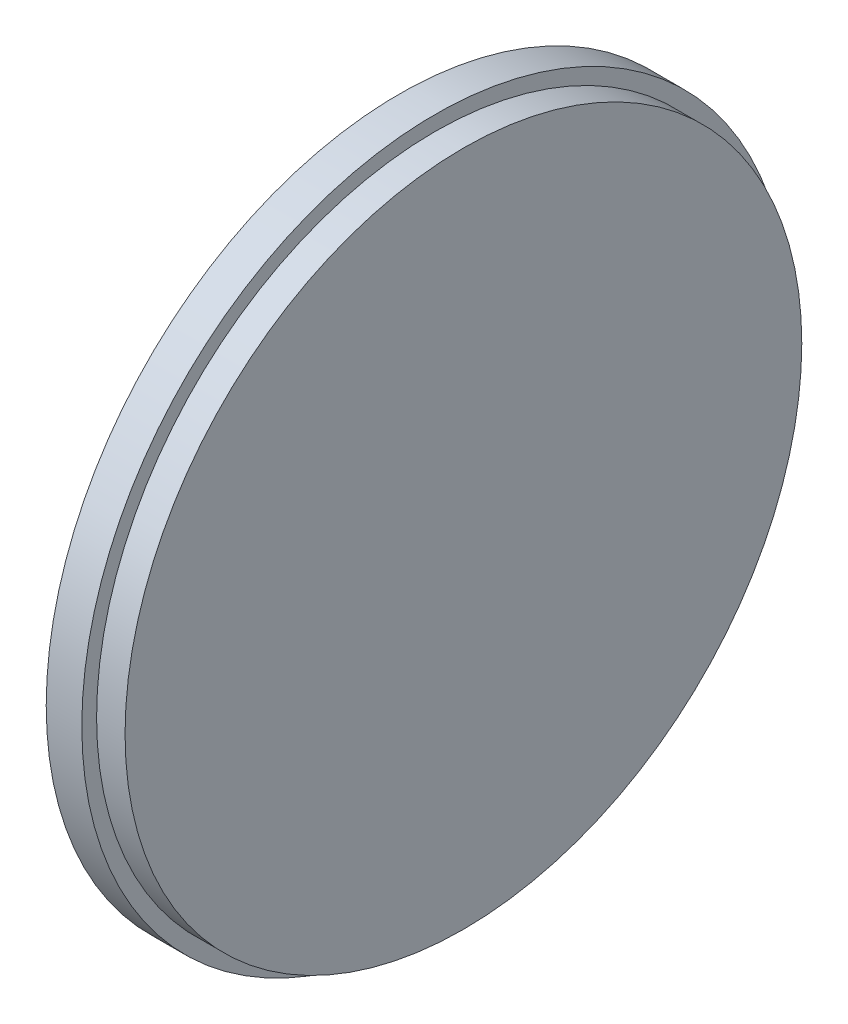
ISO-10303-21;
HEADER;
FILE_DESCRIPTION(('STEP AP214'),'2;1');
FILE_NAME('part.step','',(''),(''),'','','');
FILE_SCHEMA(('AUTOMOTIVE_DESIGN { 1 0 10303 214 1 1 1 1 }'));
ENDSEC;
DATA;
#1=APPLICATION_CONTEXT('core data for automotive mechanical design processes');
#2=APPLICATION_PROTOCOL_DEFINITION('international standard','automotive_design',2000,#1);
#3=PRODUCT_CONTEXT('',#1,'mechanical');
#4=PRODUCT('Part','Part','',(#3));
#5=PRODUCT_RELATED_PRODUCT_CATEGORY('part','',(#4));
#6=PRODUCT_DEFINITION_FORMATION('','',#4);
#7=PRODUCT_DEFINITION_CONTEXT('part definition',#1,'design');
#8=PRODUCT_DEFINITION('design','',#6,#7);
#9=PRODUCT_DEFINITION_SHAPE('','',#8);
#10=(LENGTH_UNIT() NAMED_UNIT(*) SI_UNIT(.MILLI.,.METRE.));
#11=(NAMED_UNIT(*) PLANE_ANGLE_UNIT() SI_UNIT($,.RADIAN.));
#12=(NAMED_UNIT(*) SI_UNIT($,.STERADIAN.) SOLID_ANGLE_UNIT());
#13=UNCERTAINTY_MEASURE_WITH_UNIT(LENGTH_MEASURE(1.E-05),#10,'distance_accuracy_value','');
#14=(GEOMETRIC_REPRESENTATION_CONTEXT(3) GLOBAL_UNCERTAINTY_ASSIGNED_CONTEXT((#13)) GLOBAL_UNIT_ASSIGNED_CONTEXT((#10,
#11,#12)) REPRESENTATION_CONTEXT('',''));
#15=CARTESIAN_POINT('',(0.,0.,0.));
#16=DIRECTION('',(0.,0.,1.));
#17=DIRECTION('',(1.,0.,0.));
#18=AXIS2_PLACEMENT_3D('',#15,#16,#17);
#19=CARTESIAN_POINT('',(3.25,0.,0.));
#20=DIRECTION('',(-1.,0.,0.));
#21=DIRECTION('',(0.,0.,1.));
#22=AXIS2_PLACEMENT_3D('',#19,#20,#21);
#23=CYLINDRICAL_SURFACE('',#22,32.25);
#24=CARTESIAN_POINT('',(3.25,0.,0.));
#25=DIRECTION('',(1.,0.,0.));
#26=DIRECTION('',(0.,0.,-1.));
#27=AXIS2_PLACEMENT_3D('',#24,#25,#26);
#28=CIRCLE('',#27,32.25);
#29=CARTESIAN_POINT('',(3.25,0.,32.25));
#30=VERTEX_POINT('',#29);
#31=EDGE_CURVE('E44',#30,#30,#28,.T.);
#32=CARTESIAN_POINT('',(0.,0.,0.));
#33=DIRECTION('',(1.,0.,0.));
#34=DIRECTION('',(0.,0.,-1.));
#35=AXIS2_PLACEMENT_3D('',#32,#33,#34);
#36=CIRCLE('',#35,32.25);
#37=CARTESIAN_POINT('',(0.,0.,32.25));
#38=VERTEX_POINT('',#37);
#39=EDGE_CURVE('E40',#38,#38,#36,.T.);
#40=CARTESIAN_POINT('',(3.25,0.,32.25));
#41=CARTESIAN_POINT('',(3.21614583333333,0.,32.25));
#42=CARTESIAN_POINT('',(3.18229166666667,0.,32.25));
#43=CARTESIAN_POINT('',(3.11458333333333,0.,32.25));
#44=CARTESIAN_POINT('',(3.08072916666667,0.,32.25));
#45=CARTESIAN_POINT('',(3.01302083333333,0.,32.25));
#46=CARTESIAN_POINT('',(2.97916666666667,0.,32.25));
#47=CARTESIAN_POINT('',(2.91145833333333,0.,32.25));
#48=CARTESIAN_POINT('',(2.87760416666667,0.,32.25));
#49=CARTESIAN_POINT('',(2.80989583333333,0.,32.25));
#50=CARTESIAN_POINT('',(2.77604166666667,0.,32.25));
#51=CARTESIAN_POINT('',(2.70833333333333,0.,32.25));
#52=CARTESIAN_POINT('',(2.67447916666667,0.,32.25));
#53=CARTESIAN_POINT('',(2.60677083333333,0.,32.25));
#54=CARTESIAN_POINT('',(2.57291666666667,0.,32.25));
#55=CARTESIAN_POINT('',(2.50520833333333,0.,32.25));
#56=CARTESIAN_POINT('',(2.47135416666667,0.,32.25));
#57=CARTESIAN_POINT('',(2.40364583333333,0.,32.25));
#58=CARTESIAN_POINT('',(2.36979166666667,0.,32.25));
#59=CARTESIAN_POINT('',(2.30208333333333,0.,32.25));
#60=CARTESIAN_POINT('',(2.26822916666667,0.,32.25));
#61=CARTESIAN_POINT('',(2.20052083333333,0.,32.25));
#62=CARTESIAN_POINT('',(2.16666666666667,0.,32.25));
#63=CARTESIAN_POINT('',(2.09895833333333,0.,32.25));
#64=CARTESIAN_POINT('',(2.06510416666667,0.,32.25));
#65=CARTESIAN_POINT('',(1.99739583333333,0.,32.25));
#66=CARTESIAN_POINT('',(1.96354166666667,0.,32.25));
#67=CARTESIAN_POINT('',(1.89583333333333,0.,32.25));
#68=CARTESIAN_POINT('',(1.86197916666667,0.,32.25));
#69=CARTESIAN_POINT('',(1.79427083333333,0.,32.25));
#70=CARTESIAN_POINT('',(1.76041666666667,0.,32.25));
#71=CARTESIAN_POINT('',(1.69270833333333,0.,32.25));
#72=CARTESIAN_POINT('',(1.65885416666667,0.,32.25));
#73=CARTESIAN_POINT('',(1.59114583333333,0.,32.25));
#74=CARTESIAN_POINT('',(1.55729166666667,0.,32.25));
#75=CARTESIAN_POINT('',(1.48958333333333,0.,32.25));
#76=CARTESIAN_POINT('',(1.45572916666667,0.,32.25));
#77=CARTESIAN_POINT('',(1.38802083333333,0.,32.25));
#78=CARTESIAN_POINT('',(1.35416666666667,0.,32.25));
#79=CARTESIAN_POINT('',(1.28645833333333,0.,32.25));
#80=CARTESIAN_POINT('',(1.25260416666667,0.,32.25));
#81=CARTESIAN_POINT('',(1.18489583333333,0.,32.25));
#82=CARTESIAN_POINT('',(1.15104166666667,0.,32.25));
#83=CARTESIAN_POINT('',(1.08333333333333,0.,32.25));
#84=CARTESIAN_POINT('',(1.04947916666667,0.,32.25));
#85=CARTESIAN_POINT('',(0.981770833333333,0.,32.25));
#86=CARTESIAN_POINT('',(0.947916666666667,0.,32.25));
#87=CARTESIAN_POINT('',(0.880208333333333,0.,32.25));
#88=CARTESIAN_POINT('',(0.846354166666667,0.,32.25));
#89=CARTESIAN_POINT('',(0.778645833333333,0.,32.25));
#90=CARTESIAN_POINT('',(0.744791666666667,0.,32.25));
#91=CARTESIAN_POINT('',(0.677083333333333,0.,32.25));
#92=CARTESIAN_POINT('',(0.643229166666667,0.,32.25));
#93=CARTESIAN_POINT('',(0.575520833333333,0.,32.25));
#94=CARTESIAN_POINT('',(0.541666666666667,0.,32.25));
#95=CARTESIAN_POINT('',(0.473958333333333,0.,32.25));
#96=CARTESIAN_POINT('',(0.440104166666667,0.,32.25));
#97=CARTESIAN_POINT('',(0.372395833333333,0.,32.25));
#98=CARTESIAN_POINT('',(0.338541666666667,0.,32.25));
#99=CARTESIAN_POINT('',(0.270833333333333,0.,32.25));
#100=CARTESIAN_POINT('',(0.236979166666667,0.,32.25));
#101=CARTESIAN_POINT('',(0.169270833333333,0.,32.25));
#102=CARTESIAN_POINT('',(0.135416666666667,0.,32.25));
#103=CARTESIAN_POINT('',(0.0677083333333334,0.,32.25));
#104=CARTESIAN_POINT('',(0.0338541666666667,0.,32.25));
#105=CARTESIAN_POINT('',(0.,0.,32.25));
#106=B_SPLINE_CURVE_WITH_KNOTS('',3,(#40,#41,#42,#43,#44,#45,#46,#47,#48,#49,#50,#51,#52,#53,
#54,#55,#56,#57,#58,#59,#60,#61,#62,#63,#64,#65,#66,#67,#68,#69,#70,#71,#72,#73,#74,#75,#76,#77,
#78,#79,#80,#81,#82,#83,#84,#85,#86,#87,#88,#89,#90,#91,#92,#93,#94,#95,#96,#97,#98,#99,#100,
#101,#102,#103,#104,#105),.UNSPECIFIED.,.F.,.F.,(4,2,2,2,2,2,2,2,2,2,2,2,2,2,2,2,2,2,2,2,2,2,2,
2,2,2,2,2,2,2,2,2,4),(0.,0.1015625,0.203125,0.3046875,0.40625,0.5078125,0.609375,0.7109375,
0.8125,0.9140625,1.015625,1.1171875,1.21875,1.3203125,1.421875,1.5234375,1.625,1.7265625,
1.828125,1.9296875,2.03125,2.1328125,2.234375,2.3359375,2.4375,2.5390625,2.640625,2.7421875,
2.84375,2.9453125,3.046875,3.1484375,3.25),.UNSPECIFIED.);
#107=EDGE_CURVE('BSEAM37',#30,#38,#106,.T.);
#108=ORIENTED_EDGE('',*,*,#31,.F.);
#109=ORIENTED_EDGE('',*,*,#39,.T.);
#110=ORIENTED_EDGE('',*,*,#107,.T.);
#111=ORIENTED_EDGE('',*,*,#107,.F.);
#112=EDGE_LOOP('',(#108,#110,#109,#111));
#113=FACE_BOUND('',#112,.T.);
#114=ADVANCED_FACE('F37',(#113),#23,.T.);
#115=CARTESIAN_POINT('',(3.25,0.,0.));
#116=DIRECTION('',(1.,0.,0.));
#117=DIRECTION('',(0.,0.,-1.));
#118=AXIS2_PLACEMENT_3D('',#115,#116,#117);
#119=PLANE('',#118);
#120=CARTESIAN_POINT('',(3.25,0.,0.));
#121=DIRECTION('',(1.,0.,0.));
#122=DIRECTION('',(0.,0.,-1.));
#123=AXIS2_PLACEMENT_3D('',#120,#121,#122);
#124=CIRCLE('',#123,30.9);
#125=CARTESIAN_POINT('',(3.25,0.,-30.9));
#126=VERTEX_POINT('',#125);
#127=EDGE_CURVE('E10',#126,#126,#124,.T.);
#128=ORIENTED_EDGE('',*,*,#127,.F.);
#129=EDGE_LOOP('',(#128));
#130=FACE_BOUND('',#129,.T.);
#131=ORIENTED_EDGE('',*,*,#31,.T.);
#132=EDGE_LOOP('',(#131));
#133=FACE_BOUND('',#132,.T.);
#134=ADVANCED_FACE('F61',(#130,#133),#119,.T.);
#135=CARTESIAN_POINT('',(0.,0.,0.));
#136=DIRECTION('',(1.,0.,0.));
#137=DIRECTION('',(0.,0.,-1.));
#138=AXIS2_PLACEMENT_3D('',#135,#136,#137);
#139=PLANE('',#138);
#140=ORIENTED_EDGE('',*,*,#39,.F.);
#141=EDGE_LOOP('',(#140));
#142=FACE_BOUND('',#141,.T.);
#143=ADVANCED_FACE('F58',(#142),#139,.F.);
#144=CARTESIAN_POINT('',(5.85,0.,0.));
#145=DIRECTION('',(-1.,0.,0.));
#146=DIRECTION('',(0.,0.,1.));
#147=AXIS2_PLACEMENT_3D('',#144,#145,#146);
#148=CYLINDRICAL_SURFACE('',#147,30.9);
#149=CARTESIAN_POINT('',(5.85,0.,0.));
#150=DIRECTION('',(1.,0.,0.));
#151=DIRECTION('',(0.,0.,-1.));
#152=AXIS2_PLACEMENT_3D('',#149,#150,#151);
#153=CIRCLE('',#152,30.9);
#154=CARTESIAN_POINT('',(5.85,0.,-30.9));
#155=VERTEX_POINT('',#154);
#156=EDGE_CURVE('E50',#155,#155,#153,.T.);
#157=ORIENTED_EDGE('',*,*,#156,.F.);
#158=EDGE_LOOP('',(#157));
#159=FACE_BOUND('',#158,.T.);
#160=ORIENTED_EDGE('',*,*,#127,.T.);
#161=EDGE_LOOP('',(#160));
#162=FACE_BOUND('',#161,.T.);
#163=ADVANCED_FACE('F60',(#159,#162),#148,.T.);
#164=CARTESIAN_POINT('',(5.85,0.,0.));
#165=DIRECTION('',(1.,0.,0.));
#166=DIRECTION('',(0.,0.,-1.));
#167=AXIS2_PLACEMENT_3D('',#164,#165,#166);
#168=PLANE('',#167);
#169=ORIENTED_EDGE('',*,*,#156,.T.);
#170=EDGE_LOOP('',(#169));
#171=FACE_BOUND('',#170,.T.);
#172=ADVANCED_FACE('F66',(#171),#168,.T.);
#173=CLOSED_SHELL('',(#114,#134,#143,#163,#172));
#174=MANIFOLD_SOLID_BREP('B2',#173);
#175=ADVANCED_BREP_SHAPE_REPRESENTATION('',(#18,#174),#14);
#176=SHAPE_DEFINITION_REPRESENTATION(#9,#175);
ENDSEC;
END-ISO-10303-21;
